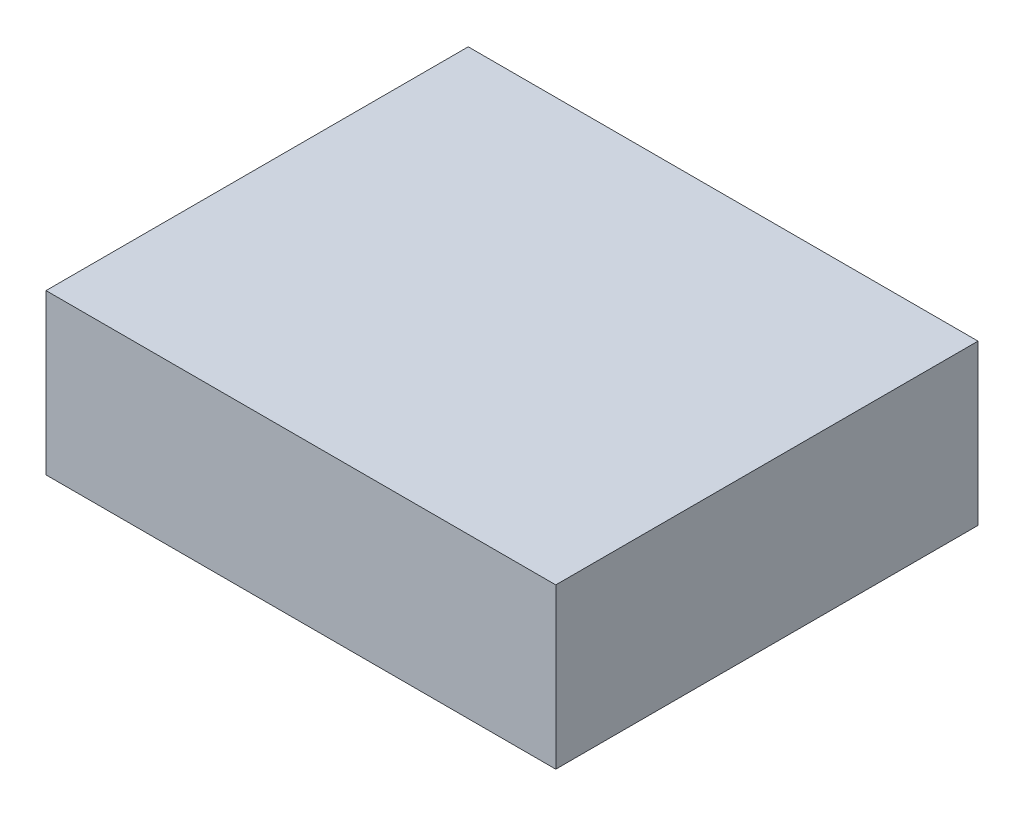
ISO-10303-21;
HEADER;
FILE_DESCRIPTION(('STEP AP214'),'2;1');
FILE_NAME('part.step','',(''),(''),'','','');
FILE_SCHEMA(('AUTOMOTIVE_DESIGN { 1 0 10303 214 1 1 1 1 }'));
ENDSEC;
DATA;
#1=APPLICATION_CONTEXT('core data for automotive mechanical design processes');
#2=APPLICATION_PROTOCOL_DEFINITION('international standard','automotive_design',2000,#1);
#3=PRODUCT_CONTEXT('',#1,'mechanical');
#4=PRODUCT('Part','Part','',(#3));
#5=PRODUCT_RELATED_PRODUCT_CATEGORY('part','',(#4));
#6=PRODUCT_DEFINITION_FORMATION('','',#4);
#7=PRODUCT_DEFINITION_CONTEXT('part definition',#1,'design');
#8=PRODUCT_DEFINITION('design','',#6,#7);
#9=PRODUCT_DEFINITION_SHAPE('','',#8);
#10=(LENGTH_UNIT() NAMED_UNIT(*) SI_UNIT(.MILLI.,.METRE.));
#11=(NAMED_UNIT(*) PLANE_ANGLE_UNIT() SI_UNIT($,.RADIAN.));
#12=(NAMED_UNIT(*) SI_UNIT($,.STERADIAN.) SOLID_ANGLE_UNIT());
#13=UNCERTAINTY_MEASURE_WITH_UNIT(LENGTH_MEASURE(1.E-05),#10,'distance_accuracy_value','');
#14=(GEOMETRIC_REPRESENTATION_CONTEXT(3) GLOBAL_UNCERTAINTY_ASSIGNED_CONTEXT((#13)) GLOBAL_UNIT_ASSIGNED_CONTEXT((#10,
#11,#12)) REPRESENTATION_CONTEXT('',''));
#15=CARTESIAN_POINT('',(0.,0.,0.));
#16=DIRECTION('',(0.,0.,1.));
#17=DIRECTION('',(1.,0.,0.));
#18=AXIS2_PLACEMENT_3D('',#15,#16,#17);
#19=CARTESIAN_POINT('',(49.5,31.,41.));
#20=DIRECTION('',(-1.,0.,0.));
#21=DIRECTION('',(0.,0.,1.));
#22=AXIS2_PLACEMENT_3D('',#19,#20,#21);
#23=PLANE('',#22);
#24=DIRECTION('',(0.,0.,-1.));
#25=VECTOR('',#24,1.);
#26=CARTESIAN_POINT('',(49.5,0.,41.));
#27=LINE('',#26,#25);
#28=CARTESIAN_POINT('',(49.5,0.,41.));
#29=VERTEX_POINT('',#28);
#30=CARTESIAN_POINT('',(49.5,0.,-41.));
#31=VERTEX_POINT('',#30);
#32=EDGE_CURVE('E100',#29,#31,#27,.T.);
#33=ORIENTED_EDGE('',*,*,#32,.T.);
#34=DIRECTION('',(0.,-1.,0.));
#35=VECTOR('',#34,1.);
#36=CARTESIAN_POINT('',(49.5,31.,-41.));
#37=LINE('',#36,#35);
#38=CARTESIAN_POINT('',(49.5,31.,-41.));
#39=VERTEX_POINT('',#38);
#40=EDGE_CURVE('E11',#39,#31,#37,.T.);
#41=ORIENTED_EDGE('',*,*,#40,.F.);
#42=DIRECTION('',(0.,0.,-1.));
#43=VECTOR('',#42,1.);
#44=CARTESIAN_POINT('',(49.5,31.,41.));
#45=LINE('',#44,#43);
#46=CARTESIAN_POINT('',(49.5,31.,41.));
#47=VERTEX_POINT('',#46);
#48=EDGE_CURVE('E88',#47,#39,#45,.T.);
#49=ORIENTED_EDGE('',*,*,#48,.F.);
#50=DIRECTION('',(0.,-1.,0.));
#51=VECTOR('',#50,1.);
#52=CARTESIAN_POINT('',(49.5,31.,41.));
#53=LINE('',#52,#51);
#54=EDGE_CURVE('E96',#47,#29,#53,.T.);
#55=ORIENTED_EDGE('',*,*,#54,.T.);
#56=EDGE_LOOP('',(#33,#41,#49,#55));
#57=FACE_BOUND('',#56,.T.);
#58=ADVANCED_FACE('F37',(#57),#23,.F.);
#59=CARTESIAN_POINT('',(-49.5,31.,-41.));
#60=DIRECTION('',(0.,0.,1.));
#61=DIRECTION('',(1.,0.,0.));
#62=AXIS2_PLACEMENT_3D('',#59,#60,#61);
#63=PLANE('',#62);
#64=DIRECTION('',(-1.,0.,0.));
#65=VECTOR('',#64,1.);
#66=CARTESIAN_POINT('',(-49.5,0.,-41.));
#67=LINE('',#66,#65);
#68=CARTESIAN_POINT('',(-49.5,0.,-41.));
#69=VERTEX_POINT('',#68);
#70=EDGE_CURVE('E92',#31,#69,#67,.T.);
#71=ORIENTED_EDGE('',*,*,#70,.T.);
#72=DIRECTION('',(0.,-1.,0.));
#73=VECTOR('',#72,1.);
#74=CARTESIAN_POINT('',(-49.5,31.,-41.));
#75=LINE('',#74,#73);
#76=CARTESIAN_POINT('',(-49.5,31.,-41.));
#77=VERTEX_POINT('',#76);
#78=EDGE_CURVE('E45',#77,#69,#75,.T.);
#79=ORIENTED_EDGE('',*,*,#78,.F.);
#80=DIRECTION('',(-1.,0.,0.));
#81=VECTOR('',#80,1.);
#82=CARTESIAN_POINT('',(-49.5,31.,-41.));
#83=LINE('',#82,#81);
#84=EDGE_CURVE('E83',#39,#77,#83,.T.);
#85=ORIENTED_EDGE('',*,*,#84,.F.);
#86=ORIENTED_EDGE('',*,*,#40,.T.);
#87=EDGE_LOOP('',(#71,#79,#85,#86));
#88=FACE_BOUND('',#87,.T.);
#89=ADVANCED_FACE('F91',(#88),#63,.F.);
#90=CARTESIAN_POINT('',(-49.5,31.,41.));
#91=DIRECTION('',(1.,0.,0.));
#92=DIRECTION('',(0.,0.,-1.));
#93=AXIS2_PLACEMENT_3D('',#90,#91,#92);
#94=PLANE('',#93);
#95=DIRECTION('',(0.,0.,1.));
#96=VECTOR('',#95,1.);
#97=CARTESIAN_POINT('',(-49.5,0.,41.));
#98=LINE('',#97,#96);
#99=CARTESIAN_POINT('',(-49.5,0.,41.));
#100=VERTEX_POINT('',#99);
#101=EDGE_CURVE('E70',#69,#100,#98,.T.);
#102=ORIENTED_EDGE('',*,*,#101,.T.);
#103=DIRECTION('',(0.,-1.,0.));
#104=VECTOR('',#103,1.);
#105=CARTESIAN_POINT('',(-49.5,31.,41.));
#106=LINE('',#105,#104);
#107=CARTESIAN_POINT('',(-49.5,31.,41.));
#108=VERTEX_POINT('',#107);
#109=EDGE_CURVE('E93',#108,#100,#106,.T.);
#110=ORIENTED_EDGE('',*,*,#109,.F.);
#111=DIRECTION('',(0.,0.,1.));
#112=VECTOR('',#111,1.);
#113=CARTESIAN_POINT('',(-49.5,31.,41.));
#114=LINE('',#113,#112);
#115=EDGE_CURVE('E86',#77,#108,#114,.T.);
#116=ORIENTED_EDGE('',*,*,#115,.F.);
#117=ORIENTED_EDGE('',*,*,#78,.T.);
#118=EDGE_LOOP('',(#102,#110,#116,#117));
#119=FACE_BOUND('',#118,.T.);
#120=ADVANCED_FACE('F94',(#119),#94,.F.);
#121=CARTESIAN_POINT('',(-49.5,31.,41.));
#122=DIRECTION('',(0.,0.,-1.));
#123=DIRECTION('',(-1.,0.,0.));
#124=AXIS2_PLACEMENT_3D('',#121,#122,#123);
#125=PLANE('',#124);
#126=DIRECTION('',(1.,0.,0.));
#127=VECTOR('',#126,1.);
#128=CARTESIAN_POINT('',(-49.5,0.,41.));
#129=LINE('',#128,#127);
#130=EDGE_CURVE('E76',#100,#29,#129,.T.);
#131=ORIENTED_EDGE('',*,*,#130,.T.);
#132=ORIENTED_EDGE('',*,*,#54,.F.);
#133=DIRECTION('',(1.,0.,0.));
#134=VECTOR('',#133,1.);
#135=CARTESIAN_POINT('',(-49.5,31.,41.));
#136=LINE('',#135,#134);
#137=EDGE_CURVE('E53',#108,#47,#136,.T.);
#138=ORIENTED_EDGE('',*,*,#137,.F.);
#139=ORIENTED_EDGE('',*,*,#109,.T.);
#140=EDGE_LOOP('',(#131,#132,#138,#139));
#141=FACE_BOUND('',#140,.T.);
#142=ADVANCED_FACE('F107',(#141),#125,.F.);
#143=CARTESIAN_POINT('',(0.,31.,0.));
#144=DIRECTION('',(0.,-1.,0.));
#145=DIRECTION('',(0.,0.,-1.));
#146=AXIS2_PLACEMENT_3D('',#143,#144,#145);
#147=PLANE('',#146);
#148=ORIENTED_EDGE('',*,*,#48,.T.);
#149=ORIENTED_EDGE('',*,*,#84,.T.);
#150=ORIENTED_EDGE('',*,*,#115,.T.);
#151=ORIENTED_EDGE('',*,*,#137,.T.);
#152=EDGE_LOOP('',(#148,#149,#150,#151));
#153=FACE_BOUND('',#152,.T.);
#154=ADVANCED_FACE('F84',(#153),#147,.F.);
#155=CARTESIAN_POINT('',(0.,0.,0.));
#156=DIRECTION('',(0.,-1.,0.));
#157=DIRECTION('',(0.,0.,-1.));
#158=AXIS2_PLACEMENT_3D('',#155,#156,#157);
#159=PLANE('',#158);
#160=ORIENTED_EDGE('',*,*,#32,.F.);
#161=ORIENTED_EDGE('',*,*,#130,.F.);
#162=ORIENTED_EDGE('',*,*,#101,.F.);
#163=ORIENTED_EDGE('',*,*,#70,.F.);
#164=EDGE_LOOP('',(#160,#161,#162,#163));
#165=FACE_BOUND('',#164,.T.);
#166=ADVANCED_FACE('F110',(#165),#159,.T.);
#167=CLOSED_SHELL('',(#58,#89,#120,#142,#154,#166));
#168=MANIFOLD_SOLID_BREP('B2',#167);
#169=ADVANCED_BREP_SHAPE_REPRESENTATION('',(#18,#168),#14);
#170=SHAPE_DEFINITION_REPRESENTATION(#9,#169);
ENDSEC;
END-ISO-10303-21;
